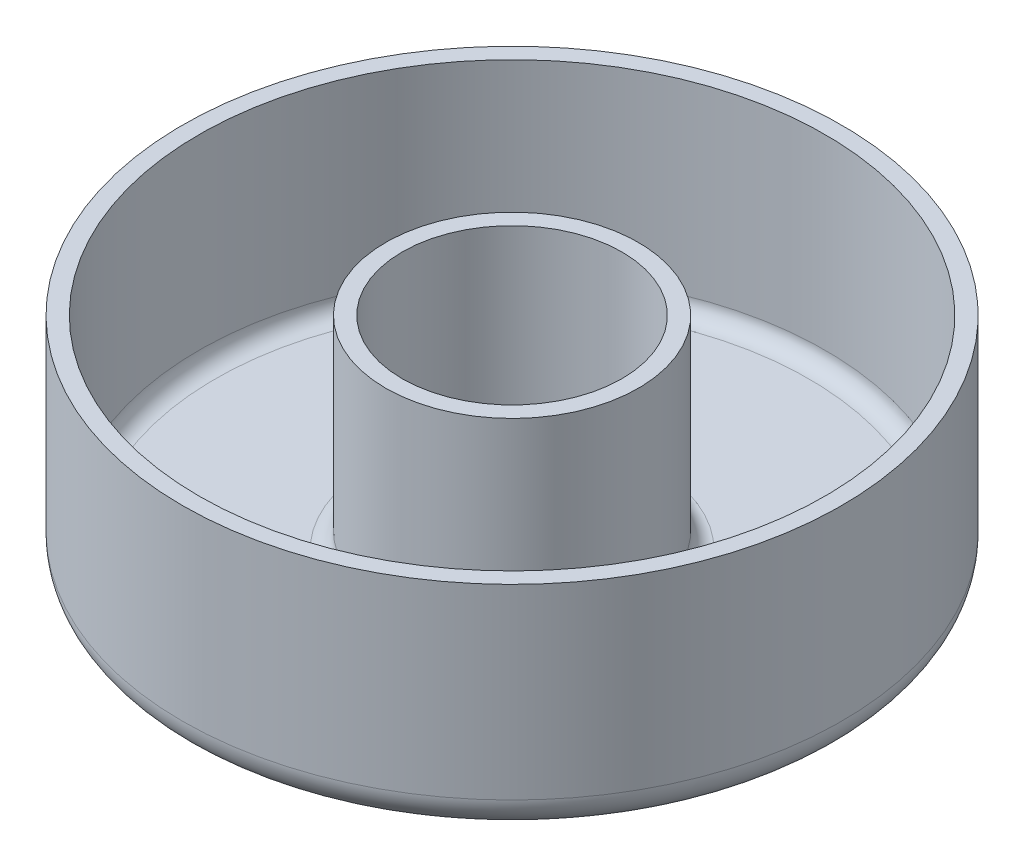
ISO-10303-21;
HEADER;
FILE_DESCRIPTION(('STEP AP214'),'2;1');
FILE_NAME('part.step','',(''),(''),'','','');
FILE_SCHEMA(('AUTOMOTIVE_DESIGN { 1 0 10303 214 1 1 1 1 }'));
ENDSEC;
DATA;
#1=APPLICATION_CONTEXT('core data for automotive mechanical design processes');
#2=APPLICATION_PROTOCOL_DEFINITION('international standard','automotive_design',2000,#1);
#3=PRODUCT_CONTEXT('',#1,'mechanical');
#4=PRODUCT('Part','Part','',(#3));
#5=PRODUCT_RELATED_PRODUCT_CATEGORY('part','',(#4));
#6=PRODUCT_DEFINITION_FORMATION('','',#4);
#7=PRODUCT_DEFINITION_CONTEXT('part definition',#1,'design');
#8=PRODUCT_DEFINITION('design','',#6,#7);
#9=PRODUCT_DEFINITION_SHAPE('','',#8);
#10=(LENGTH_UNIT() NAMED_UNIT(*) SI_UNIT(.MILLI.,.METRE.));
#11=(NAMED_UNIT(*) PLANE_ANGLE_UNIT() SI_UNIT($,.RADIAN.));
#12=(NAMED_UNIT(*) SI_UNIT($,.STERADIAN.) SOLID_ANGLE_UNIT());
#13=UNCERTAINTY_MEASURE_WITH_UNIT(LENGTH_MEASURE(1.E-05),#10,'distance_accuracy_value','');
#14=(GEOMETRIC_REPRESENTATION_CONTEXT(3) GLOBAL_UNCERTAINTY_ASSIGNED_CONTEXT((#13)) GLOBAL_UNIT_ASSIGNED_CONTEXT((#10,
#11,#12)) REPRESENTATION_CONTEXT('',''));
#15=CARTESIAN_POINT('',(0.,0.,0.));
#16=DIRECTION('',(0.,0.,1.));
#17=DIRECTION('',(1.,0.,0.));
#18=AXIS2_PLACEMENT_3D('',#15,#16,#17);
#19=CARTESIAN_POINT('',(0.,4.25,5.75));
#20=DIRECTION('',(0.,1.,0.));
#21=DIRECTION('',(0.,0.,1.));
#22=AXIS2_PLACEMENT_3D('',#19,#20,#21);
#23=PLANE('',#22);
#24=CARTESIAN_POINT('',(0.,4.25,0.));
#25=DIRECTION('',(0.,1.,0.));
#26=DIRECTION('',(0.,0.,1.));
#27=AXIS2_PLACEMENT_3D('',#24,#25,#26);
#28=CIRCLE('',#27,5.75);
#29=CARTESIAN_POINT('',(0.,4.25,5.75));
#30=VERTEX_POINT('',#29);
#31=EDGE_CURVE('E71',#30,#30,#28,.T.);
#32=ORIENTED_EDGE('',*,*,#31,.T.);
#33=EDGE_LOOP('',(#32));
#34=FACE_BOUND('',#33,.T.);
#35=CARTESIAN_POINT('',(0.,4.25,0.));
#36=DIRECTION('',(0.,1.,0.));
#37=DIRECTION('',(0.,0.,1.));
#38=AXIS2_PLACEMENT_3D('',#35,#36,#37);
#39=CIRCLE('',#38,5.);
#40=CARTESIAN_POINT('',(0.,4.25,5.));
#41=VERTEX_POINT('',#40);
#42=EDGE_CURVE('E10',#41,#41,#39,.T.);
#43=ORIENTED_EDGE('',*,*,#42,.F.);
#44=EDGE_LOOP('',(#43));
#45=FACE_BOUND('',#44,.T.);
#46=ADVANCED_FACE('F31',(#34,#45),#23,.T.);
#47=CARTESIAN_POINT('',(0.,14.8723924348122,0.));
#48=DIRECTION('',(0.,1.,0.));
#49=DIRECTION('',(0.,0.,1.));
#50=AXIS2_PLACEMENT_3D('',#47,#48,#49);
#51=CYLINDRICAL_SURFACE('',#50,5.);
#52=ORIENTED_EDGE('',*,*,#42,.T.);
#53=EDGE_LOOP('',(#52));
#54=FACE_BOUND('',#53,.T.);
#55=CARTESIAN_POINT('',(0.,-4.25,0.));
#56=DIRECTION('',(0.,1.,0.));
#57=DIRECTION('',(0.,0.,1.));
#58=AXIS2_PLACEMENT_3D('',#55,#56,#57);
#59=CIRCLE('',#58,5.);
#60=CARTESIAN_POINT('',(0.,-4.25,5.));
#61=VERTEX_POINT('',#60);
#62=EDGE_CURVE('E37',#61,#61,#59,.T.);
#63=ORIENTED_EDGE('',*,*,#62,.F.);
#64=EDGE_LOOP('',(#63));
#65=FACE_BOUND('',#64,.T.);
#66=ADVANCED_FACE('F89',(#54,#65),#51,.F.);
#67=CARTESIAN_POINT('',(0.,-4.25,0.));
#68=DIRECTION('',(0.,1.,0.));
#69=DIRECTION('',(0.,0.,1.));
#70=AXIS2_PLACEMENT_3D('',#67,#68,#69);
#71=TOROIDAL_SURFACE('',#70,6.5,1.5);
#72=ORIENTED_EDGE('',*,*,#62,.T.);
#73=EDGE_LOOP('',(#72));
#74=FACE_BOUND('',#73,.T.);
#75=CARTESIAN_POINT('',(0.,-5.75,0.));
#76=DIRECTION('',(0.,1.,0.));
#77=DIRECTION('',(0.,0.,1.));
#78=AXIS2_PLACEMENT_3D('',#75,#76,#77);
#79=CIRCLE('',#78,6.5);
#80=CARTESIAN_POINT('',(0.,-5.75,6.5));
#81=VERTEX_POINT('',#80);
#82=EDGE_CURVE('E41',#81,#81,#79,.T.);
#83=ORIENTED_EDGE('',*,*,#82,.F.);
#84=EDGE_LOOP('',(#83));
#85=FACE_BOUND('',#84,.T.);
#86=ADVANCED_FACE('F93',(#74,#85),#71,.T.);
#87=CARTESIAN_POINT('',(0.,-5.75,6.5));
#88=DIRECTION('',(0.,-1.,0.));
#89=DIRECTION('',(0.,0.,-1.));
#90=AXIS2_PLACEMENT_3D('',#87,#88,#89);
#91=PLANE('',#90);
#92=ORIENTED_EDGE('',*,*,#82,.T.);
#93=EDGE_LOOP('',(#92));
#94=FACE_BOUND('',#93,.T.);
#95=CARTESIAN_POINT('',(0.,-5.75,0.));
#96=DIRECTION('',(0.,1.,0.));
#97=DIRECTION('',(0.,0.,1.));
#98=AXIS2_PLACEMENT_3D('',#95,#96,#97);
#99=CIRCLE('',#98,13.5);
#100=CARTESIAN_POINT('',(0.,-5.75,13.5));
#101=VERTEX_POINT('',#100);
#102=EDGE_CURVE('E45',#101,#101,#99,.T.);
#103=ORIENTED_EDGE('',*,*,#102,.F.);
#104=EDGE_LOOP('',(#103));
#105=FACE_BOUND('',#104,.T.);
#106=ADVANCED_FACE('F97',(#94,#105),#91,.T.);
#107=CARTESIAN_POINT('',(0.,-4.25,0.));
#108=DIRECTION('',(0.,1.,0.));
#109=DIRECTION('',(0.,0.,1.));
#110=AXIS2_PLACEMENT_3D('',#107,#108,#109);
#111=TOROIDAL_SURFACE('',#110,13.5,1.5);
#112=ORIENTED_EDGE('',*,*,#102,.T.);
#113=EDGE_LOOP('',(#112));
#114=FACE_BOUND('',#113,.T.);
#115=CARTESIAN_POINT('',(0.,-4.25,0.));
#116=DIRECTION('',(0.,1.,0.));
#117=DIRECTION('',(0.,0.,1.));
#118=AXIS2_PLACEMENT_3D('',#115,#116,#117);
#119=CIRCLE('',#118,15.);
#120=CARTESIAN_POINT('',(0.,-4.25,15.));
#121=VERTEX_POINT('',#120);
#122=EDGE_CURVE('E50',#121,#121,#119,.T.);
#123=ORIENTED_EDGE('',*,*,#122,.F.);
#124=EDGE_LOOP('',(#123));
#125=FACE_BOUND('',#124,.T.);
#126=ADVANCED_FACE('F103',(#114,#125),#111,.T.);
#127=CARTESIAN_POINT('',(0.,14.8723924348122,0.));
#128=DIRECTION('',(0.,1.,0.));
#129=DIRECTION('',(0.,0.,1.));
#130=AXIS2_PLACEMENT_3D('',#127,#128,#129);
#131=CYLINDRICAL_SURFACE('',#130,15.);
#132=ORIENTED_EDGE('',*,*,#122,.T.);
#133=EDGE_LOOP('',(#132));
#134=FACE_BOUND('',#133,.T.);
#135=CARTESIAN_POINT('',(0.,4.25,0.));
#136=DIRECTION('',(0.,1.,0.));
#137=DIRECTION('',(0.,0.,1.));
#138=AXIS2_PLACEMENT_3D('',#135,#136,#137);
#139=CIRCLE('',#138,15.);
#140=CARTESIAN_POINT('',(0.,4.25,15.));
#141=VERTEX_POINT('',#140);
#142=EDGE_CURVE('E53',#141,#141,#139,.T.);
#143=ORIENTED_EDGE('',*,*,#142,.F.);
#144=EDGE_LOOP('',(#143));
#145=FACE_BOUND('',#144,.T.);
#146=ADVANCED_FACE('F107',(#134,#145),#131,.T.);
#147=CARTESIAN_POINT('',(0.,4.25,15.));
#148=DIRECTION('',(0.,1.,0.));
#149=DIRECTION('',(0.,0.,1.));
#150=AXIS2_PLACEMENT_3D('',#147,#148,#149);
#151=PLANE('',#150);
#152=ORIENTED_EDGE('',*,*,#142,.T.);
#153=EDGE_LOOP('',(#152));
#154=FACE_BOUND('',#153,.T.);
#155=CARTESIAN_POINT('',(0.,4.25,0.));
#156=DIRECTION('',(0.,1.,0.));
#157=DIRECTION('',(0.,0.,1.));
#158=AXIS2_PLACEMENT_3D('',#155,#156,#157);
#159=CIRCLE('',#158,14.25);
#160=CARTESIAN_POINT('',(0.,4.25,14.25));
#161=VERTEX_POINT('',#160);
#162=EDGE_CURVE('E56',#161,#161,#159,.T.);
#163=ORIENTED_EDGE('',*,*,#162,.F.);
#164=EDGE_LOOP('',(#163));
#165=FACE_BOUND('',#164,.T.);
#166=ADVANCED_FACE('F111',(#154,#165),#151,.T.);
#167=CARTESIAN_POINT('',(0.,14.8723924348122,0.));
#168=DIRECTION('',(0.,1.,0.));
#169=DIRECTION('',(0.,0.,1.));
#170=AXIS2_PLACEMENT_3D('',#167,#168,#169);
#171=CYLINDRICAL_SURFACE('',#170,14.25);
#172=ORIENTED_EDGE('',*,*,#162,.T.);
#173=EDGE_LOOP('',(#172));
#174=FACE_BOUND('',#173,.T.);
#175=CARTESIAN_POINT('',(0.,-4.25,0.));
#176=DIRECTION('',(0.,1.,0.));
#177=DIRECTION('',(0.,0.,1.));
#178=AXIS2_PLACEMENT_3D('',#175,#176,#177);
#179=CIRCLE('',#178,14.25);
#180=CARTESIAN_POINT('',(0.,-4.25,14.25));
#181=VERTEX_POINT('',#180);
#182=EDGE_CURVE('E59',#181,#181,#179,.T.);
#183=ORIENTED_EDGE('',*,*,#182,.F.);
#184=EDGE_LOOP('',(#183));
#185=FACE_BOUND('',#184,.T.);
#186=ADVANCED_FACE('F115',(#174,#185),#171,.F.);
#187=CARTESIAN_POINT('',(0.,-4.25,0.));
#188=DIRECTION('',(0.,1.,0.));
#189=DIRECTION('',(0.,0.,1.));
#190=AXIS2_PLACEMENT_3D('',#187,#188,#189);
#191=TOROIDAL_SURFACE('',#190,13.5,0.750000000000001);
#192=ORIENTED_EDGE('',*,*,#182,.T.);
#193=EDGE_LOOP('',(#192));
#194=FACE_BOUND('',#193,.T.);
#195=CARTESIAN_POINT('',(0.,-5.,0.));
#196=DIRECTION('',(0.,1.,0.));
#197=DIRECTION('',(0.,0.,1.));
#198=AXIS2_PLACEMENT_3D('',#195,#196,#197);
#199=CIRCLE('',#198,13.5);
#200=CARTESIAN_POINT('',(0.,-5.,13.5));
#201=VERTEX_POINT('',#200);
#202=EDGE_CURVE('E62',#201,#201,#199,.T.);
#203=ORIENTED_EDGE('',*,*,#202,.F.);
#204=EDGE_LOOP('',(#203));
#205=FACE_BOUND('',#204,.T.);
#206=ADVANCED_FACE('F119',(#194,#205),#191,.F.);
#207=CARTESIAN_POINT('',(0.,-5.,6.5));
#208=DIRECTION('',(0.,1.,0.));
#209=DIRECTION('',(0.,0.,1.));
#210=AXIS2_PLACEMENT_3D('',#207,#208,#209);
#211=PLANE('',#210);
#212=ORIENTED_EDGE('',*,*,#202,.T.);
#213=EDGE_LOOP('',(#212));
#214=FACE_BOUND('',#213,.T.);
#215=CARTESIAN_POINT('',(0.,-5.,0.));
#216=DIRECTION('',(0.,1.,0.));
#217=DIRECTION('',(0.,0.,1.));
#218=AXIS2_PLACEMENT_3D('',#215,#216,#217);
#219=CIRCLE('',#218,6.5);
#220=CARTESIAN_POINT('',(0.,-5.,6.5));
#221=VERTEX_POINT('',#220);
#222=EDGE_CURVE('E65',#221,#221,#219,.T.);
#223=ORIENTED_EDGE('',*,*,#222,.F.);
#224=EDGE_LOOP('',(#223));
#225=FACE_BOUND('',#224,.T.);
#226=ADVANCED_FACE('F85',(#214,#225),#211,.T.);
#227=CARTESIAN_POINT('',(0.,-4.25,0.));
#228=DIRECTION('',(0.,1.,0.));
#229=DIRECTION('',(0.,0.,1.));
#230=AXIS2_PLACEMENT_3D('',#227,#228,#229);
#231=TOROIDAL_SURFACE('',#230,6.5,0.75);
#232=ORIENTED_EDGE('',*,*,#222,.T.);
#233=EDGE_LOOP('',(#232));
#234=FACE_BOUND('',#233,.T.);
#235=CARTESIAN_POINT('',(0.,-4.25,0.));
#236=DIRECTION('',(0.,1.,0.));
#237=DIRECTION('',(0.,0.,1.));
#238=AXIS2_PLACEMENT_3D('',#235,#236,#237);
#239=CIRCLE('',#238,5.75);
#240=CARTESIAN_POINT('',(0.,-4.25,5.75));
#241=VERTEX_POINT('',#240);
#242=EDGE_CURVE('E68',#241,#241,#239,.T.);
#243=ORIENTED_EDGE('',*,*,#242,.F.);
#244=EDGE_LOOP('',(#243));
#245=FACE_BOUND('',#244,.T.);
#246=ADVANCED_FACE('F79',(#234,#245),#231,.F.);
#247=CARTESIAN_POINT('',(0.,14.8723924348122,0.));
#248=DIRECTION('',(0.,1.,0.));
#249=DIRECTION('',(0.,0.,1.));
#250=AXIS2_PLACEMENT_3D('',#247,#248,#249);
#251=CYLINDRICAL_SURFACE('',#250,5.75);
#252=ORIENTED_EDGE('',*,*,#242,.T.);
#253=EDGE_LOOP('',(#252));
#254=FACE_BOUND('',#253,.T.);
#255=ORIENTED_EDGE('',*,*,#31,.F.);
#256=EDGE_LOOP('',(#255));
#257=FACE_BOUND('',#256,.T.);
#258=ADVANCED_FACE('F77',(#254,#257),#251,.T.);
#259=CLOSED_SHELL('',(#46,#66,#86,#106,#126,#146,#166,#186,#206,#226,#246,#258));
#260=MANIFOLD_SOLID_BREP('B2',#259);
#261=ADVANCED_BREP_SHAPE_REPRESENTATION('',(#18,#260),#14);
#262=SHAPE_DEFINITION_REPRESENTATION(#9,#261);
ENDSEC;
END-ISO-10303-21;
